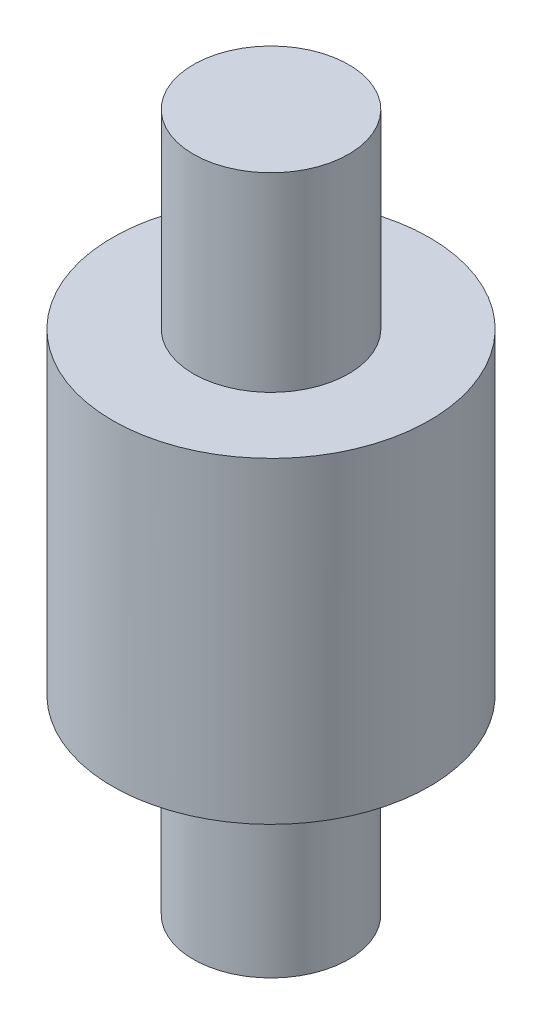
ISO-10303-21;
HEADER;
FILE_DESCRIPTION(('STEP AP214'),'2;1');
FILE_NAME('part.step','',(''),(''),'','','');
FILE_SCHEMA(('AUTOMOTIVE_DESIGN { 1 0 10303 214 1 1 1 1 }'));
ENDSEC;
DATA;
#1=APPLICATION_CONTEXT('core data for automotive mechanical design processes');
#2=APPLICATION_PROTOCOL_DEFINITION('international standard','automotive_design',2000,#1);
#3=PRODUCT_CONTEXT('',#1,'mechanical');
#4=PRODUCT('Part','Part','',(#3));
#5=PRODUCT_RELATED_PRODUCT_CATEGORY('part','',(#4));
#6=PRODUCT_DEFINITION_FORMATION('','',#4);
#7=PRODUCT_DEFINITION_CONTEXT('part definition',#1,'design');
#8=PRODUCT_DEFINITION('design','',#6,#7);
#9=PRODUCT_DEFINITION_SHAPE('','',#8);
#10=(LENGTH_UNIT() NAMED_UNIT(*) SI_UNIT(.MILLI.,.METRE.));
#11=(NAMED_UNIT(*) PLANE_ANGLE_UNIT() SI_UNIT($,.RADIAN.));
#12=(NAMED_UNIT(*) SI_UNIT($,.STERADIAN.) SOLID_ANGLE_UNIT());
#13=UNCERTAINTY_MEASURE_WITH_UNIT(LENGTH_MEASURE(1.E-05),#10,'distance_accuracy_value','');
#14=(GEOMETRIC_REPRESENTATION_CONTEXT(3) GLOBAL_UNCERTAINTY_ASSIGNED_CONTEXT((#13)) GLOBAL_UNIT_ASSIGNED_CONTEXT((#10,
#11,#12)) REPRESENTATION_CONTEXT('',''));
#15=CARTESIAN_POINT('',(0.,0.,0.));
#16=DIRECTION('',(0.,0.,1.));
#17=DIRECTION('',(1.,0.,0.));
#18=AXIS2_PLACEMENT_3D('',#15,#16,#17);
#19=CARTESIAN_POINT('',(0.,22.,0.));
#20=DIRECTION('',(0.,-1.,0.));
#21=DIRECTION('',(0.,0.,-1.));
#22=AXIS2_PLACEMENT_3D('',#19,#20,#21);
#23=CYLINDRICAL_SURFACE('',#22,5.);
#24=CARTESIAN_POINT('',(0.,16.,0.));
#25=DIRECTION('',(0.,1.,0.));
#26=DIRECTION('',(0.,0.,1.));
#27=AXIS2_PLACEMENT_3D('',#24,#25,#26);
#28=CIRCLE('',#27,5.);
#29=CARTESIAN_POINT('',(0.,16.,5.));
#30=VERTEX_POINT('',#29);
#31=EDGE_CURVE('E10',#30,#30,#28,.T.);
#32=ORIENTED_EDGE('',*,*,#31,.F.);
#33=EDGE_LOOP('',(#32));
#34=FACE_BOUND('',#33,.T.);
#35=CARTESIAN_POINT('',(0.,6.,0.));
#36=DIRECTION('',(0.,-1.,0.));
#37=DIRECTION('',(0.,0.,-1.));
#38=AXIS2_PLACEMENT_3D('',#35,#36,#37);
#39=CIRCLE('',#38,5.);
#40=CARTESIAN_POINT('',(0.,6.,-5.));
#41=VERTEX_POINT('',#40);
#42=EDGE_CURVE('E44',#41,#41,#39,.T.);
#43=ORIENTED_EDGE('',*,*,#42,.F.);
#44=EDGE_LOOP('',(#43));
#45=FACE_BOUND('',#44,.T.);
#46=ADVANCED_FACE('F31',(#34,#45),#23,.T.);
#47=CARTESIAN_POINT('',(0.,16.,0.));
#48=DIRECTION('',(0.,1.,0.));
#49=DIRECTION('',(0.,0.,1.));
#50=AXIS2_PLACEMENT_3D('',#47,#48,#49);
#51=CYLINDRICAL_SURFACE('',#50,2.45);
#52=CARTESIAN_POINT('',(0.,16.,0.));
#53=DIRECTION('',(0.,1.,0.));
#54=DIRECTION('',(0.,0.,1.));
#55=AXIS2_PLACEMENT_3D('',#52,#53,#54);
#56=CIRCLE('',#55,2.45);
#57=CARTESIAN_POINT('',(0.,16.,2.45));
#58=VERTEX_POINT('',#57);
#59=EDGE_CURVE('E38',#58,#58,#56,.T.);
#60=ORIENTED_EDGE('',*,*,#59,.T.);
#61=EDGE_LOOP('',(#60));
#62=FACE_BOUND('',#61,.T.);
#63=CARTESIAN_POINT('',(0.,22.,0.));
#64=DIRECTION('',(0.,1.,0.));
#65=DIRECTION('',(0.,0.,1.));
#66=AXIS2_PLACEMENT_3D('',#63,#64,#65);
#67=CIRCLE('',#66,2.45);
#68=CARTESIAN_POINT('',(0.,22.,2.45));
#69=VERTEX_POINT('',#68);
#70=EDGE_CURVE('E34',#69,#69,#67,.T.);
#71=ORIENTED_EDGE('',*,*,#70,.F.);
#72=EDGE_LOOP('',(#71));
#73=FACE_BOUND('',#72,.T.);
#74=ADVANCED_FACE('F65',(#62,#73),#51,.T.);
#75=CARTESIAN_POINT('',(0.,16.,0.));
#76=DIRECTION('',(0.,1.,0.));
#77=DIRECTION('',(0.,0.,1.));
#78=AXIS2_PLACEMENT_3D('',#75,#76,#77);
#79=PLANE('',#78);
#80=ORIENTED_EDGE('',*,*,#59,.F.);
#81=EDGE_LOOP('',(#80));
#82=FACE_BOUND('',#81,.T.);
#83=ORIENTED_EDGE('',*,*,#31,.T.);
#84=EDGE_LOOP('',(#83));
#85=FACE_BOUND('',#84,.T.);
#86=ADVANCED_FACE('F70',(#82,#85),#79,.T.);
#87=CARTESIAN_POINT('',(0.,22.,0.));
#88=DIRECTION('',(0.,1.,0.));
#89=DIRECTION('',(0.,0.,1.));
#90=AXIS2_PLACEMENT_3D('',#87,#88,#89);
#91=PLANE('',#90);
#92=ORIENTED_EDGE('',*,*,#70,.T.);
#93=EDGE_LOOP('',(#92));
#94=FACE_BOUND('',#93,.T.);
#95=ADVANCED_FACE('F60',(#94),#91,.T.);
#96=CARTESIAN_POINT('',(0.,6.,0.));
#97=DIRECTION('',(0.,-1.,0.));
#98=DIRECTION('',(0.,0.,-1.));
#99=AXIS2_PLACEMENT_3D('',#96,#97,#98);
#100=PLANE('',#99);
#101=CARTESIAN_POINT('',(0.,6.,0.));
#102=DIRECTION('',(0.,-1.,0.));
#103=DIRECTION('',(0.,0.,-1.));
#104=AXIS2_PLACEMENT_3D('',#101,#102,#103);
#105=CIRCLE('',#104,2.45);
#106=CARTESIAN_POINT('',(0.,6.,-2.45));
#107=VERTEX_POINT('',#106);
#108=EDGE_CURVE('E47',#107,#107,#105,.T.);
#109=ORIENTED_EDGE('',*,*,#108,.F.);
#110=EDGE_LOOP('',(#109));
#111=FACE_BOUND('',#110,.T.);
#112=ORIENTED_EDGE('',*,*,#42,.T.);
#113=EDGE_LOOP('',(#112));
#114=FACE_BOUND('',#113,.T.);
#115=ADVANCED_FACE('F57',(#111,#114),#100,.T.);
#116=CARTESIAN_POINT('',(0.,6.,0.));
#117=DIRECTION('',(0.,-1.,0.));
#118=DIRECTION('',(0.,0.,-1.));
#119=AXIS2_PLACEMENT_3D('',#116,#117,#118);
#120=CYLINDRICAL_SURFACE('',#119,2.45);
#121=ORIENTED_EDGE('',*,*,#108,.T.);
#122=EDGE_LOOP('',(#121));
#123=FACE_BOUND('',#122,.T.);
#124=CARTESIAN_POINT('',(0.,0.,0.));
#125=DIRECTION('',(0.,-1.,0.));
#126=DIRECTION('',(0.,0.,-1.));
#127=AXIS2_PLACEMENT_3D('',#124,#125,#126);
#128=CIRCLE('',#127,2.45);
#129=CARTESIAN_POINT('',(0.,0.,-2.45));
#130=VERTEX_POINT('',#129);
#131=EDGE_CURVE('E48',#130,#130,#128,.T.);
#132=ORIENTED_EDGE('',*,*,#131,.F.);
#133=EDGE_LOOP('',(#132));
#134=FACE_BOUND('',#133,.T.);
#135=ADVANCED_FACE('F54',(#123,#134),#120,.T.);
#136=CARTESIAN_POINT('',(0.,0.,0.));
#137=DIRECTION('',(0.,1.,0.));
#138=DIRECTION('',(0.,0.,1.));
#139=AXIS2_PLACEMENT_3D('',#136,#137,#138);
#140=PLANE('',#139);
#141=ORIENTED_EDGE('',*,*,#131,.T.);
#142=EDGE_LOOP('',(#141));
#143=FACE_BOUND('',#142,.T.);
#144=ADVANCED_FACE('F82',(#143),#140,.F.);
#145=CLOSED_SHELL('',(#46,#74,#86,#95,#115,#135,#144));
#146=MANIFOLD_SOLID_BREP('B2',#145);
#147=ADVANCED_BREP_SHAPE_REPRESENTATION('',(#18,#146),#14);
#148=SHAPE_DEFINITION_REPRESENTATION(#9,#147);
ENDSEC;
END-ISO-10303-21;
